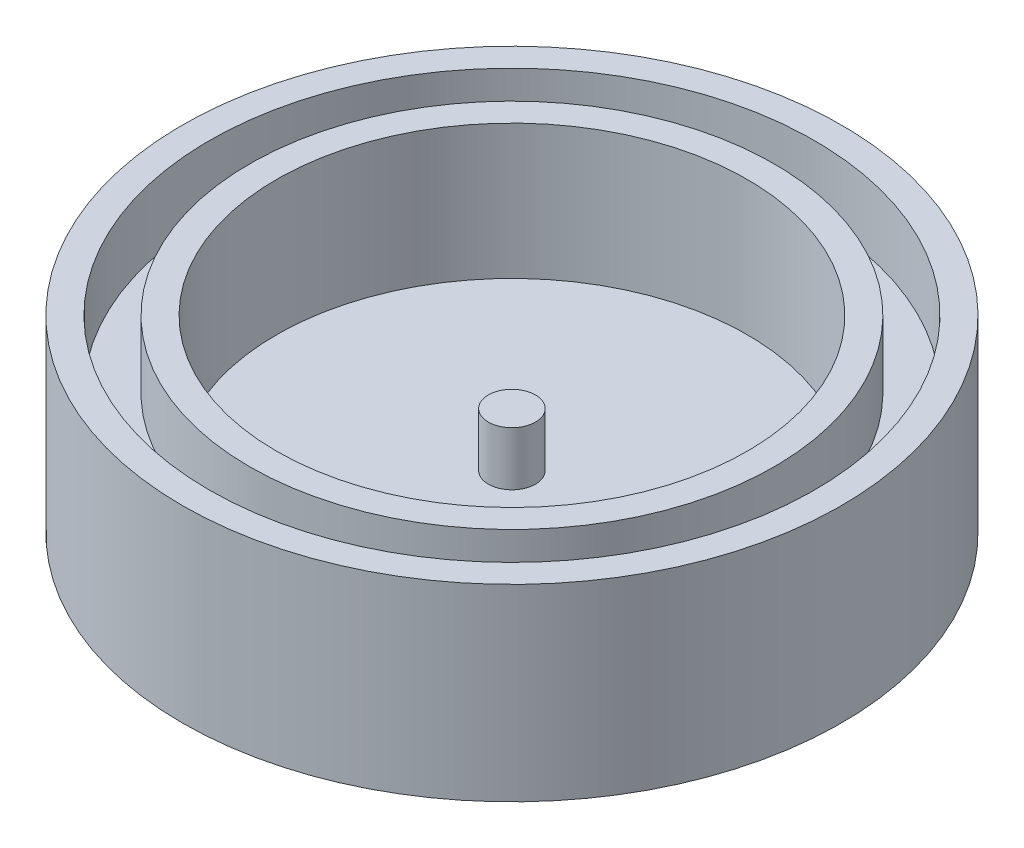
ISO-10303-21;
HEADER;
FILE_DESCRIPTION(('STEP AP214'),'2;1');
FILE_NAME('part.step','',(''),(''),'','','');
FILE_SCHEMA(('AUTOMOTIVE_DESIGN { 1 0 10303 214 1 1 1 1 }'));
ENDSEC;
DATA;
#1=APPLICATION_CONTEXT('core data for automotive mechanical design processes');
#2=APPLICATION_PROTOCOL_DEFINITION('international standard','automotive_design',2000,#1);
#3=PRODUCT_CONTEXT('',#1,'mechanical');
#4=PRODUCT('Part','Part','',(#3));
#5=PRODUCT_RELATED_PRODUCT_CATEGORY('part','',(#4));
#6=PRODUCT_DEFINITION_FORMATION('','',#4);
#7=PRODUCT_DEFINITION_CONTEXT('part definition',#1,'design');
#8=PRODUCT_DEFINITION('design','',#6,#7);
#9=PRODUCT_DEFINITION_SHAPE('','',#8);
#10=(LENGTH_UNIT() NAMED_UNIT(*) SI_UNIT(.MILLI.,.METRE.));
#11=(NAMED_UNIT(*) PLANE_ANGLE_UNIT() SI_UNIT($,.RADIAN.));
#12=(NAMED_UNIT(*) SI_UNIT($,.STERADIAN.) SOLID_ANGLE_UNIT());
#13=UNCERTAINTY_MEASURE_WITH_UNIT(LENGTH_MEASURE(1.E-05),#10,'distance_accuracy_value','');
#14=(GEOMETRIC_REPRESENTATION_CONTEXT(3) GLOBAL_UNCERTAINTY_ASSIGNED_CONTEXT((#13)) GLOBAL_UNIT_ASSIGNED_CONTEXT((#10,
#11,#12)) REPRESENTATION_CONTEXT('',''));
#15=CARTESIAN_POINT('',(0.,0.,0.));
#16=DIRECTION('',(0.,0.,1.));
#17=DIRECTION('',(1.,0.,0.));
#18=AXIS2_PLACEMENT_3D('',#15,#16,#17);
#19=CARTESIAN_POINT('',(0.,0.,0.));
#20=DIRECTION('',(0.,-1.,0.));
#21=DIRECTION('',(0.,0.,-1.));
#22=AXIS2_PLACEMENT_3D('',#19,#20,#21);
#23=PLANE('',#22);
#24=CARTESIAN_POINT('',(0.,0.,0.));
#25=DIRECTION('',(0.,1.,0.));
#26=DIRECTION('',(0.,0.,1.));
#27=AXIS2_PLACEMENT_3D('',#24,#25,#26);
#28=CIRCLE('',#27,24.5);
#29=CARTESIAN_POINT('',(0.,0.,24.5));
#30=VERTEX_POINT('',#29);
#31=EDGE_CURVE('E10',#30,#30,#28,.T.);
#32=ORIENTED_EDGE('',*,*,#31,.F.);
#33=EDGE_LOOP('',(#32));
#34=FACE_BOUND('',#33,.T.);
#35=ADVANCED_FACE('F37',(#34),#23,.T.);
#36=CARTESIAN_POINT('',(0.,8.,0.));
#37=DIRECTION('',(0.,1.,0.));
#38=DIRECTION('',(0.,0.,1.));
#39=AXIS2_PLACEMENT_3D('',#36,#37,#38);
#40=CYLINDRICAL_SURFACE('',#39,24.5);
#41=ORIENTED_EDGE('',*,*,#31,.T.);
#42=EDGE_LOOP('',(#41));
#43=FACE_BOUND('',#42,.T.);
#44=CARTESIAN_POINT('',(0.,14.,0.));
#45=DIRECTION('',(0.,1.,0.));
#46=DIRECTION('',(0.,0.,1.));
#47=AXIS2_PLACEMENT_3D('',#44,#45,#46);
#48=CIRCLE('',#47,24.5);
#49=CARTESIAN_POINT('',(0.,14.,24.5));
#50=VERTEX_POINT('',#49);
#51=EDGE_CURVE('E43',#50,#50,#48,.T.);
#52=ORIENTED_EDGE('',*,*,#51,.F.);
#53=EDGE_LOOP('',(#52));
#54=FACE_BOUND('',#53,.T.);
#55=ADVANCED_FACE('F91',(#43,#54),#40,.T.);
#56=CARTESIAN_POINT('',(-24.5,14.,0.));
#57=DIRECTION('',(0.,1.,0.));
#58=DIRECTION('',(0.,0.,1.));
#59=AXIS2_PLACEMENT_3D('',#56,#57,#58);
#60=PLANE('',#59);
#61=ORIENTED_EDGE('',*,*,#51,.T.);
#62=EDGE_LOOP('',(#61));
#63=FACE_BOUND('',#62,.T.);
#64=CARTESIAN_POINT('',(0.,14.,0.));
#65=DIRECTION('',(0.,1.,0.));
#66=DIRECTION('',(0.,0.,1.));
#67=AXIS2_PLACEMENT_3D('',#64,#65,#66);
#68=CIRCLE('',#67,22.5);
#69=CARTESIAN_POINT('',(0.,14.,22.5));
#70=VERTEX_POINT('',#69);
#71=EDGE_CURVE('E47',#70,#70,#68,.T.);
#72=ORIENTED_EDGE('',*,*,#71,.F.);
#73=EDGE_LOOP('',(#72));
#74=FACE_BOUND('',#73,.T.);
#75=ADVANCED_FACE('F96',(#63,#74),#60,.T.);
#76=CARTESIAN_POINT('',(0.,8.,0.));
#77=DIRECTION('',(0.,1.,0.));
#78=DIRECTION('',(0.,0.,1.));
#79=AXIS2_PLACEMENT_3D('',#76,#77,#78);
#80=CYLINDRICAL_SURFACE('',#79,22.5);
#81=ORIENTED_EDGE('',*,*,#71,.T.);
#82=EDGE_LOOP('',(#81));
#83=FACE_BOUND('',#82,.T.);
#84=CARTESIAN_POINT('',(0.,9.,0.));
#85=DIRECTION('',(0.,1.,0.));
#86=DIRECTION('',(0.,0.,1.));
#87=AXIS2_PLACEMENT_3D('',#84,#85,#86);
#88=CIRCLE('',#87,22.5);
#89=CARTESIAN_POINT('',(0.,9.,22.5));
#90=VERTEX_POINT('',#89);
#91=EDGE_CURVE('E51',#90,#90,#88,.T.);
#92=ORIENTED_EDGE('',*,*,#91,.F.);
#93=EDGE_LOOP('',(#92));
#94=FACE_BOUND('',#93,.T.);
#95=ADVANCED_FACE('F100',(#83,#94),#80,.F.);
#96=CARTESIAN_POINT('',(-22.5,9.,0.));
#97=DIRECTION('',(0.,1.,0.));
#98=DIRECTION('',(0.,0.,1.));
#99=AXIS2_PLACEMENT_3D('',#96,#97,#98);
#100=PLANE('',#99);
#101=ORIENTED_EDGE('',*,*,#91,.T.);
#102=EDGE_LOOP('',(#101));
#103=FACE_BOUND('',#102,.T.);
#104=CARTESIAN_POINT('',(0.,9.,0.));
#105=DIRECTION('',(0.,1.,0.));
#106=DIRECTION('',(0.,0.,1.));
#107=AXIS2_PLACEMENT_3D('',#104,#105,#106);
#108=CIRCLE('',#107,19.5);
#109=CARTESIAN_POINT('',(0.,9.,19.5));
#110=VERTEX_POINT('',#109);
#111=EDGE_CURVE('E56',#110,#110,#108,.T.);
#112=ORIENTED_EDGE('',*,*,#111,.F.);
#113=EDGE_LOOP('',(#112));
#114=FACE_BOUND('',#113,.T.);
#115=ADVANCED_FACE('F106',(#103,#114),#100,.T.);
#116=CARTESIAN_POINT('',(0.,8.,0.));
#117=DIRECTION('',(0.,1.,0.));
#118=DIRECTION('',(0.,0.,1.));
#119=AXIS2_PLACEMENT_3D('',#116,#117,#118);
#120=CYLINDRICAL_SURFACE('',#119,19.5);
#121=ORIENTED_EDGE('',*,*,#111,.T.);
#122=EDGE_LOOP('',(#121));
#123=FACE_BOUND('',#122,.T.);
#124=CARTESIAN_POINT('',(0.,14.,0.));
#125=DIRECTION('',(0.,1.,0.));
#126=DIRECTION('',(0.,0.,1.));
#127=AXIS2_PLACEMENT_3D('',#124,#125,#126);
#128=CIRCLE('',#127,19.5);
#129=CARTESIAN_POINT('',(0.,14.,19.5));
#130=VERTEX_POINT('',#129);
#131=EDGE_CURVE('E59',#130,#130,#128,.T.);
#132=ORIENTED_EDGE('',*,*,#131,.F.);
#133=EDGE_LOOP('',(#132));
#134=FACE_BOUND('',#133,.T.);
#135=ADVANCED_FACE('F110',(#123,#134),#120,.T.);
#136=CARTESIAN_POINT('',(-19.5,14.,0.));
#137=DIRECTION('',(0.,1.,0.));
#138=DIRECTION('',(0.,0.,1.));
#139=AXIS2_PLACEMENT_3D('',#136,#137,#138);
#140=PLANE('',#139);
#141=ORIENTED_EDGE('',*,*,#131,.T.);
#142=EDGE_LOOP('',(#141));
#143=FACE_BOUND('',#142,.T.);
#144=CARTESIAN_POINT('',(0.,14.,0.));
#145=DIRECTION('',(0.,1.,0.));
#146=DIRECTION('',(0.,0.,1.));
#147=AXIS2_PLACEMENT_3D('',#144,#145,#146);
#148=CIRCLE('',#147,17.5);
#149=CARTESIAN_POINT('',(0.,14.,17.5));
#150=VERTEX_POINT('',#149);
#151=EDGE_CURVE('E62',#150,#150,#148,.T.);
#152=ORIENTED_EDGE('',*,*,#151,.F.);
#153=EDGE_LOOP('',(#152));
#154=FACE_BOUND('',#153,.T.);
#155=ADVANCED_FACE('F114',(#143,#154),#140,.T.);
#156=CARTESIAN_POINT('',(0.,8.,0.));
#157=DIRECTION('',(0.,1.,0.));
#158=DIRECTION('',(0.,0.,1.));
#159=AXIS2_PLACEMENT_3D('',#156,#157,#158);
#160=CYLINDRICAL_SURFACE('',#159,17.5);
#161=ORIENTED_EDGE('',*,*,#151,.T.);
#162=EDGE_LOOP('',(#161));
#163=FACE_BOUND('',#162,.T.);
#164=CARTESIAN_POINT('',(0.,4.,0.));
#165=DIRECTION('',(0.,1.,0.));
#166=DIRECTION('',(0.,0.,1.));
#167=AXIS2_PLACEMENT_3D('',#164,#165,#166);
#168=CIRCLE('',#167,17.5);
#169=CARTESIAN_POINT('',(0.,4.,17.5));
#170=VERTEX_POINT('',#169);
#171=EDGE_CURVE('E65',#170,#170,#168,.T.);
#172=ORIENTED_EDGE('',*,*,#171,.F.);
#173=EDGE_LOOP('',(#172));
#174=FACE_BOUND('',#173,.T.);
#175=ADVANCED_FACE('F87',(#163,#174),#160,.F.);
#176=CARTESIAN_POINT('',(-17.5,4.,0.));
#177=DIRECTION('',(0.,1.,0.));
#178=DIRECTION('',(0.,0.,1.));
#179=AXIS2_PLACEMENT_3D('',#176,#177,#178);
#180=PLANE('',#179);
#181=ORIENTED_EDGE('',*,*,#171,.T.);
#182=EDGE_LOOP('',(#181));
#183=FACE_BOUND('',#182,.T.);
#184=CARTESIAN_POINT('',(0.,4.,0.));
#185=DIRECTION('',(0.,1.,0.));
#186=DIRECTION('',(0.,0.,1.));
#187=AXIS2_PLACEMENT_3D('',#184,#185,#186);
#188=CIRCLE('',#187,1.75);
#189=CARTESIAN_POINT('',(0.,4.,1.75));
#190=VERTEX_POINT('',#189);
#191=EDGE_CURVE('E68',#190,#190,#188,.T.);
#192=ORIENTED_EDGE('',*,*,#191,.F.);
#193=EDGE_LOOP('',(#192));
#194=FACE_BOUND('',#193,.T.);
#195=ADVANCED_FACE('F79',(#183,#194),#180,.T.);
#196=CARTESIAN_POINT('',(0.,8.,0.));
#197=DIRECTION('',(0.,1.,0.));
#198=DIRECTION('',(0.,0.,1.));
#199=AXIS2_PLACEMENT_3D('',#196,#197,#198);
#200=CYLINDRICAL_SURFACE('',#199,1.75);
#201=ORIENTED_EDGE('',*,*,#191,.T.);
#202=EDGE_LOOP('',(#201));
#203=FACE_BOUND('',#202,.T.);
#204=CARTESIAN_POINT('',(0.,8.,0.));
#205=DIRECTION('',(0.,1.,0.));
#206=DIRECTION('',(0.,0.,1.));
#207=AXIS2_PLACEMENT_3D('',#204,#205,#206);
#208=CIRCLE('',#207,1.75);
#209=CARTESIAN_POINT('',(0.,8.,1.75));
#210=VERTEX_POINT('',#209);
#211=EDGE_CURVE('E71',#210,#210,#208,.T.);
#212=ORIENTED_EDGE('',*,*,#211,.F.);
#213=EDGE_LOOP('',(#212));
#214=FACE_BOUND('',#213,.T.);
#215=ADVANCED_FACE('F77',(#203,#214),#200,.T.);
#216=CARTESIAN_POINT('',(-1.75,8.,0.));
#217=DIRECTION('',(0.,1.,0.));
#218=DIRECTION('',(0.,0.,1.));
#219=AXIS2_PLACEMENT_3D('',#216,#217,#218);
#220=PLANE('',#219);
#221=ORIENTED_EDGE('',*,*,#211,.T.);
#222=EDGE_LOOP('',(#221));
#223=FACE_BOUND('',#222,.T.);
#224=ADVANCED_FACE('F75',(#223),#220,.T.);
#225=CLOSED_SHELL('',(#35,#55,#75,#95,#115,#135,#155,#175,#195,#215,#224));
#226=MANIFOLD_SOLID_BREP('B2',#225);
#227=ADVANCED_BREP_SHAPE_REPRESENTATION('',(#18,#226),#14);
#228=SHAPE_DEFINITION_REPRESENTATION(#9,#227);
ENDSEC;
END-ISO-10303-21;
